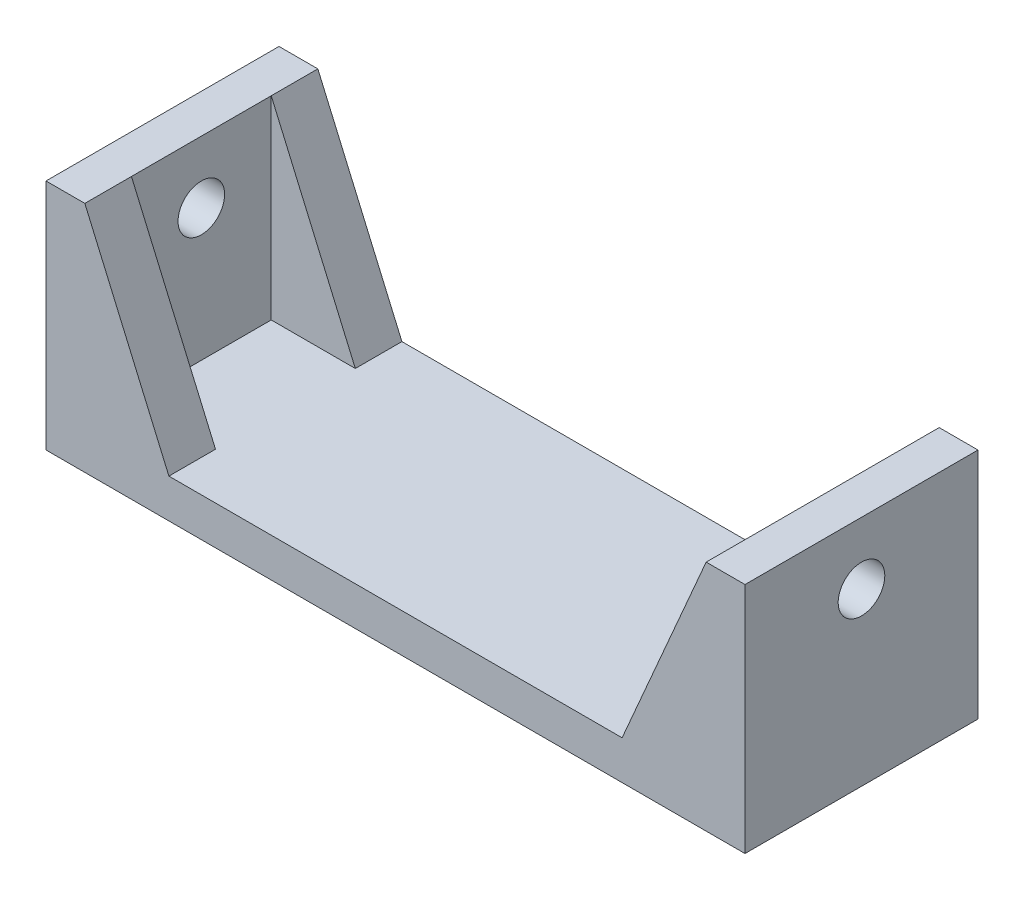
ISO-10303-21;
HEADER;
FILE_DESCRIPTION(('STEP AP214'),'2;1');
FILE_NAME('part.step','',(''),(''),'','','');
FILE_SCHEMA(('AUTOMOTIVE_DESIGN { 1 0 10303 214 1 1 1 1 }'));
ENDSEC;
DATA;
#1=APPLICATION_CONTEXT('core data for automotive mechanical design processes');
#2=APPLICATION_PROTOCOL_DEFINITION('international standard','automotive_design',2000,#1);
#3=PRODUCT_CONTEXT('',#1,'mechanical');
#4=PRODUCT('Part','Part','',(#3));
#5=PRODUCT_RELATED_PRODUCT_CATEGORY('part','',(#4));
#6=PRODUCT_DEFINITION_FORMATION('','',#4);
#7=PRODUCT_DEFINITION_CONTEXT('part definition',#1,'design');
#8=PRODUCT_DEFINITION('design','',#6,#7);
#9=PRODUCT_DEFINITION_SHAPE('','',#8);
#10=(LENGTH_UNIT() NAMED_UNIT(*) SI_UNIT(.MILLI.,.METRE.));
#11=(NAMED_UNIT(*) PLANE_ANGLE_UNIT() SI_UNIT($,.RADIAN.));
#12=(NAMED_UNIT(*) SI_UNIT($,.STERADIAN.) SOLID_ANGLE_UNIT());
#13=UNCERTAINTY_MEASURE_WITH_UNIT(LENGTH_MEASURE(1.E-05),#10,'distance_accuracy_value','');
#14=(GEOMETRIC_REPRESENTATION_CONTEXT(3) GLOBAL_UNCERTAINTY_ASSIGNED_CONTEXT((#13)) GLOBAL_UNIT_ASSIGNED_CONTEXT((#10,
#11,#12)) REPRESENTATION_CONTEXT('',''));
#15=CARTESIAN_POINT('',(0.,0.,0.));
#16=DIRECTION('',(0.,0.,1.));
#17=DIRECTION('',(1.,0.,0.));
#18=AXIS2_PLACEMENT_3D('',#15,#16,#17);
#19=CARTESIAN_POINT('',(5.,30.,0.));
#20=DIRECTION('',(1.,0.,0.));
#21=DIRECTION('',(0.,0.,-1.));
#22=AXIS2_PLACEMENT_3D('',#19,#20,#21);
#23=PLANE('',#22);
#24=CARTESIAN_POINT('',(5.,22.,-15.));
#25=DIRECTION('',(1.,0.,0.));
#26=DIRECTION('',(0.,0.,-1.));
#27=AXIS2_PLACEMENT_3D('',#24,#25,#26);
#28=CIRCLE('',#27,3.);
#29=CARTESIAN_POINT('',(5.,22.,-18.));
#30=VERTEX_POINT('',#29);
#31=EDGE_CURVE('E185',#30,#30,#28,.T.);
#32=ORIENTED_EDGE('',*,*,#31,.F.);
#33=EDGE_LOOP('',(#32));
#34=FACE_BOUND('',#33,.T.);
#35=DIRECTION('',(0.,0.,1.));
#36=VECTOR('',#35,1.);
#37=CARTESIAN_POINT('',(5.,5.,0.));
#38=LINE('',#37,#36);
#39=CARTESIAN_POINT('',(5.,5.,-24.));
#40=VERTEX_POINT('',#39);
#41=CARTESIAN_POINT('',(5.,5.,-6.));
#42=VERTEX_POINT('',#41);
#43=EDGE_CURVE('E191',#40,#42,#38,.T.);
#44=ORIENTED_EDGE('',*,*,#43,.F.);
#45=DIRECTION('',(0.,1.,0.));
#46=VECTOR('',#45,1.);
#47=CARTESIAN_POINT('',(5.,30.,-24.));
#48=LINE('',#47,#46);
#49=CARTESIAN_POINT('',(5.,30.,-24.));
#50=VERTEX_POINT('',#49);
#51=EDGE_CURVE('E47',#40,#50,#48,.T.);
#52=ORIENTED_EDGE('',*,*,#51,.T.);
#53=DIRECTION('',(0.,0.,1.));
#54=VECTOR('',#53,1.);
#55=CARTESIAN_POINT('',(5.,30.,0.));
#56=LINE('',#55,#54);
#57=CARTESIAN_POINT('',(5.,30.,-6.));
#58=VERTEX_POINT('',#57);
#59=EDGE_CURVE('E203',#50,#58,#56,.T.);
#60=ORIENTED_EDGE('',*,*,#59,.T.);
#61=DIRECTION('',(0.,-1.,0.));
#62=VECTOR('',#61,1.);
#63=CARTESIAN_POINT('',(5.,30.,-6.));
#64=LINE('',#63,#62);
#65=EDGE_CURVE('E173',#58,#42,#64,.T.);
#66=ORIENTED_EDGE('',*,*,#65,.T.);
#67=EDGE_LOOP('',(#44,#52,#60,#66));
#68=FACE_BOUND('',#67,.T.);
#69=ADVANCED_FACE('F32',(#34,#68),#23,.T.);
#70=CARTESIAN_POINT('',(85.,30.,0.));
#71=DIRECTION('',(-1.,0.,0.));
#72=DIRECTION('',(0.,0.,1.));
#73=AXIS2_PLACEMENT_3D('',#70,#71,#72);
#74=PLANE('',#73);
#75=CARTESIAN_POINT('',(85.,22.,-15.));
#76=DIRECTION('',(-1.,0.,0.));
#77=DIRECTION('',(0.,0.,1.));
#78=AXIS2_PLACEMENT_3D('',#75,#76,#77);
#79=CIRCLE('',#78,3.);
#80=CARTESIAN_POINT('',(85.,22.,-18.));
#81=VERTEX_POINT('',#80);
#82=EDGE_CURVE('E184',#81,#81,#79,.T.);
#83=ORIENTED_EDGE('',*,*,#82,.F.);
#84=EDGE_LOOP('',(#83));
#85=FACE_BOUND('',#84,.T.);
#86=DIRECTION('',(0.,0.,-1.));
#87=VECTOR('',#86,1.);
#88=CARTESIAN_POINT('',(85.,30.,0.));
#89=LINE('',#88,#87);
#90=CARTESIAN_POINT('',(85.,30.,-6.));
#91=VERTEX_POINT('',#90);
#92=CARTESIAN_POINT('',(85.,30.,-24.));
#93=VERTEX_POINT('',#92);
#94=EDGE_CURVE('E201',#91,#93,#89,.T.);
#95=ORIENTED_EDGE('',*,*,#94,.T.);
#96=DIRECTION('',(0.,-1.,0.));
#97=VECTOR('',#96,1.);
#98=CARTESIAN_POINT('',(85.,30.,-24.));
#99=LINE('',#98,#97);
#100=CARTESIAN_POINT('',(85.,5.,-24.));
#101=VERTEX_POINT('',#100);
#102=EDGE_CURVE('E153',#93,#101,#99,.T.);
#103=ORIENTED_EDGE('',*,*,#102,.T.);
#104=DIRECTION('',(0.,0.,-1.));
#105=VECTOR('',#104,1.);
#106=CARTESIAN_POINT('',(85.,5.,0.));
#107=LINE('',#106,#105);
#108=CARTESIAN_POINT('',(85.,5.,-6.));
#109=VERTEX_POINT('',#108);
#110=EDGE_CURVE('E194',#109,#101,#107,.T.);
#111=ORIENTED_EDGE('',*,*,#110,.F.);
#112=DIRECTION('',(0.,1.,0.));
#113=VECTOR('',#112,1.);
#114=CARTESIAN_POINT('',(85.,30.,-6.));
#115=LINE('',#114,#113);
#116=EDGE_CURVE('E165',#109,#91,#115,.T.);
#117=ORIENTED_EDGE('',*,*,#116,.T.);
#118=EDGE_LOOP('',(#95,#103,#111,#117));
#119=FACE_BOUND('',#118,.T.);
#120=ADVANCED_FACE('F264',(#85,#119),#74,.T.);
#121=CARTESIAN_POINT('',(0.,30.,0.));
#122=DIRECTION('',(0.,-1.,0.));
#123=DIRECTION('',(0.,0.,-1.));
#124=AXIS2_PLACEMENT_3D('',#121,#122,#123);
#125=PLANE('',#124);
#126=DIRECTION('',(0.,0.,1.));
#127=VECTOR('',#126,1.);
#128=CARTESIAN_POINT('',(0.,30.,0.));
#129=LINE('',#128,#127);
#130=CARTESIAN_POINT('',(0.,30.,-30.));
#131=VERTEX_POINT('',#130);
#132=CARTESIAN_POINT('',(0.,30.,0.));
#133=VERTEX_POINT('',#132);
#134=EDGE_CURVE('E205',#131,#133,#129,.T.);
#135=ORIENTED_EDGE('',*,*,#134,.T.);
#136=DIRECTION('',(1.,0.,0.));
#137=VECTOR('',#136,1.);
#138=CARTESIAN_POINT('',(0.,30.,0.));
#139=LINE('',#138,#137);
#140=CARTESIAN_POINT('',(5.,30.,0.));
#141=VERTEX_POINT('',#140);
#142=EDGE_CURVE('E209',#133,#141,#139,.T.);
#143=ORIENTED_EDGE('',*,*,#142,.T.);
#144=DIRECTION('',(0.,0.,-1.));
#145=VECTOR('',#144,1.);
#146=CARTESIAN_POINT('',(5.,30.,0.));
#147=LINE('',#146,#145);
#148=EDGE_CURVE('E178',#58,#141,#147,.F.);
#149=ORIENTED_EDGE('',*,*,#148,.F.);
#150=ORIENTED_EDGE('',*,*,#59,.F.);
#151=CARTESIAN_POINT('',(5.,30.,-30.));
#152=VERTEX_POINT('',#151);
#153=EDGE_CURVE('E143',#152,#50,#56,.T.);
#154=ORIENTED_EDGE('',*,*,#153,.F.);
#155=DIRECTION('',(-1.,0.,0.));
#156=VECTOR('',#155,1.);
#157=CARTESIAN_POINT('',(0.,30.,-30.));
#158=LINE('',#157,#156);
#159=EDGE_CURVE('E213',#152,#131,#158,.T.);
#160=ORIENTED_EDGE('',*,*,#159,.T.);
#161=EDGE_LOOP('',(#135,#143,#149,#150,#154,#160));
#162=FACE_BOUND('',#161,.T.);
#163=ADVANCED_FACE('F284',(#162),#125,.F.);
#164=DIRECTION('',(0.,0.,1.));
#165=VECTOR('',#164,1.);
#166=CARTESIAN_POINT('',(85.,30.,0.));
#167=LINE('',#166,#165);
#168=CARTESIAN_POINT('',(85.,30.,-30.));
#169=VERTEX_POINT('',#168);
#170=EDGE_CURVE('E158',#93,#169,#167,.F.);
#171=ORIENTED_EDGE('',*,*,#170,.F.);
#172=ORIENTED_EDGE('',*,*,#94,.F.);
#173=CARTESIAN_POINT('',(85.,30.,0.));
#174=VERTEX_POINT('',#173);
#175=EDGE_CURVE('E197',#174,#91,#89,.T.);
#176=ORIENTED_EDGE('',*,*,#175,.F.);
#177=CARTESIAN_POINT('',(90.,30.,0.));
#178=VERTEX_POINT('',#177);
#179=EDGE_CURVE('E207',#174,#178,#139,.T.);
#180=ORIENTED_EDGE('',*,*,#179,.T.);
#181=DIRECTION('',(0.,0.,-1.));
#182=VECTOR('',#181,1.);
#183=CARTESIAN_POINT('',(90.,30.,0.));
#184=LINE('',#183,#182);
#185=CARTESIAN_POINT('',(90.,30.,-30.));
#186=VERTEX_POINT('',#185);
#187=EDGE_CURVE('E211',#178,#186,#184,.T.);
#188=ORIENTED_EDGE('',*,*,#187,.T.);
#189=EDGE_CURVE('E214',#186,#169,#158,.T.);
#190=ORIENTED_EDGE('',*,*,#189,.T.);
#191=EDGE_LOOP('',(#171,#172,#176,#180,#188,#190));
#192=FACE_BOUND('',#191,.T.);
#193=ADVANCED_FACE('F261',(#192),#125,.F.);
#194=CARTESIAN_POINT('',(0.,30.,0.));
#195=DIRECTION('',(1.,0.,0.));
#196=DIRECTION('',(0.,0.,-1.));
#197=AXIS2_PLACEMENT_3D('',#194,#195,#196);
#198=PLANE('',#197);
#199=DIRECTION('',(0.,0.,1.));
#200=VECTOR('',#199,1.);
#201=CARTESIAN_POINT('',(0.,0.,0.));
#202=LINE('',#201,#200);
#203=CARTESIAN_POINT('',(0.,0.,-30.));
#204=VERTEX_POINT('',#203);
#205=CARTESIAN_POINT('',(0.,0.,0.));
#206=VERTEX_POINT('',#205);
#207=EDGE_CURVE('E200',#204,#206,#202,.T.);
#208=ORIENTED_EDGE('',*,*,#207,.T.);
#209=DIRECTION('',(0.,-1.,0.));
#210=VECTOR('',#209,1.);
#211=CARTESIAN_POINT('',(0.,30.,0.));
#212=LINE('',#211,#210);
#213=EDGE_CURVE('E231',#133,#206,#212,.T.);
#214=ORIENTED_EDGE('',*,*,#213,.F.);
#215=ORIENTED_EDGE('',*,*,#134,.F.);
#216=DIRECTION('',(0.,-1.,0.));
#217=VECTOR('',#216,1.);
#218=CARTESIAN_POINT('',(0.,30.,-30.));
#219=LINE('',#218,#217);
#220=EDGE_CURVE('E216',#131,#204,#219,.T.);
#221=ORIENTED_EDGE('',*,*,#220,.T.);
#222=EDGE_LOOP('',(#208,#214,#215,#221));
#223=FACE_BOUND('',#222,.T.);
#224=CARTESIAN_POINT('',(0.,22.,-15.));
#225=DIRECTION('',(1.,0.,0.));
#226=DIRECTION('',(0.,0.,-1.));
#227=AXIS2_PLACEMENT_3D('',#224,#225,#226);
#228=CIRCLE('',#227,3.);
#229=CARTESIAN_POINT('',(0.,22.,-18.));
#230=VERTEX_POINT('',#229);
#231=EDGE_CURVE('E181',#230,#230,#228,.T.);
#232=ORIENTED_EDGE('',*,*,#231,.T.);
#233=EDGE_LOOP('',(#232));
#234=FACE_BOUND('',#233,.T.);
#235=ADVANCED_FACE('F34',(#223,#234),#198,.F.);
#236=CARTESIAN_POINT('',(0.,30.,0.));
#237=DIRECTION('',(0.,0.,-1.));
#238=DIRECTION('',(-1.,0.,0.));
#239=AXIS2_PLACEMENT_3D('',#236,#237,#238);
#240=PLANE('',#239);
#241=ORIENTED_EDGE('',*,*,#179,.F.);
#242=DIRECTION('',(-0.397352390435187,-0.917666103664858,0.));
#243=VECTOR('',#242,1.);
#244=CARTESIAN_POINT('',(85.,30.,0.));
#245=LINE('',#244,#243);
#246=CARTESIAN_POINT('',(74.1749191550093,5.,0.));
#247=VERTEX_POINT('',#246);
#248=EDGE_CURVE('E162',#174,#247,#245,.T.);
#249=ORIENTED_EDGE('',*,*,#248,.T.);
#250=DIRECTION('',(1.,0.,0.));
#251=VECTOR('',#250,1.);
#252=CARTESIAN_POINT('',(0.,5.,0.));
#253=LINE('',#252,#251);
#254=CARTESIAN_POINT('',(15.8250808449907,5.,0.));
#255=VERTEX_POINT('',#254);
#256=EDGE_CURVE('E193',#255,#247,#253,.T.);
#257=ORIENTED_EDGE('',*,*,#256,.F.);
#258=DIRECTION('',(0.397352390435187,-0.917666103664858,0.));
#259=VECTOR('',#258,1.);
#260=CARTESIAN_POINT('',(5.,30.,0.));
#261=LINE('',#260,#259);
#262=EDGE_CURVE('E170',#141,#255,#261,.T.);
#263=ORIENTED_EDGE('',*,*,#262,.F.);
#264=ORIENTED_EDGE('',*,*,#142,.F.);
#265=ORIENTED_EDGE('',*,*,#213,.T.);
#266=DIRECTION('',(1.,0.,0.));
#267=VECTOR('',#266,1.);
#268=CARTESIAN_POINT('',(0.,0.,0.));
#269=LINE('',#268,#267);
#270=CARTESIAN_POINT('',(90.,0.,0.));
#271=VERTEX_POINT('',#270);
#272=EDGE_CURVE('E218',#206,#271,#269,.T.);
#273=ORIENTED_EDGE('',*,*,#272,.T.);
#274=DIRECTION('',(0.,-1.,0.));
#275=VECTOR('',#274,1.);
#276=CARTESIAN_POINT('',(90.,30.,0.));
#277=LINE('',#276,#275);
#278=EDGE_CURVE('E228',#178,#271,#277,.T.);
#279=ORIENTED_EDGE('',*,*,#278,.F.);
#280=EDGE_LOOP('',(#241,#249,#257,#263,#264,#265,#273,#279));
#281=FACE_BOUND('',#280,.T.);
#282=ADVANCED_FACE('F305',(#281),#240,.F.);
#283=CARTESIAN_POINT('',(90.,30.,0.));
#284=DIRECTION('',(-1.,0.,0.));
#285=DIRECTION('',(0.,0.,1.));
#286=AXIS2_PLACEMENT_3D('',#283,#284,#285);
#287=PLANE('',#286);
#288=DIRECTION('',(0.,-1.,0.));
#289=VECTOR('',#288,1.);
#290=CARTESIAN_POINT('',(90.,30.,-30.));
#291=LINE('',#290,#289);
#292=CARTESIAN_POINT('',(90.,0.,-30.));
#293=VERTEX_POINT('',#292);
#294=EDGE_CURVE('E225',#186,#293,#291,.T.);
#295=ORIENTED_EDGE('',*,*,#294,.F.);
#296=ORIENTED_EDGE('',*,*,#187,.F.);
#297=ORIENTED_EDGE('',*,*,#278,.T.);
#298=DIRECTION('',(0.,0.,-1.));
#299=VECTOR('',#298,1.);
#300=CARTESIAN_POINT('',(90.,0.,0.));
#301=LINE('',#300,#299);
#302=EDGE_CURVE('E220',#271,#293,#301,.T.);
#303=ORIENTED_EDGE('',*,*,#302,.T.);
#304=EDGE_LOOP('',(#295,#296,#297,#303));
#305=FACE_BOUND('',#304,.T.);
#306=CARTESIAN_POINT('',(90.,22.,-15.));
#307=DIRECTION('',(-1.,0.,0.));
#308=DIRECTION('',(0.,0.,1.));
#309=AXIS2_PLACEMENT_3D('',#306,#307,#308);
#310=CIRCLE('',#309,3.);
#311=CARTESIAN_POINT('',(90.,22.,-18.));
#312=VERTEX_POINT('',#311);
#313=EDGE_CURVE('E188',#312,#312,#310,.T.);
#314=ORIENTED_EDGE('',*,*,#313,.T.);
#315=EDGE_LOOP('',(#314));
#316=FACE_BOUND('',#315,.T.);
#317=ADVANCED_FACE('F303',(#305,#316),#287,.F.);
#318=CARTESIAN_POINT('',(0.,30.,-30.));
#319=DIRECTION('',(0.,0.,1.));
#320=DIRECTION('',(1.,0.,0.));
#321=AXIS2_PLACEMENT_3D('',#318,#319,#320);
#322=PLANE('',#321);
#323=ORIENTED_EDGE('',*,*,#159,.F.);
#324=DIRECTION('',(0.397352390435187,-0.917666103664858,0.));
#325=VECTOR('',#324,1.);
#326=CARTESIAN_POINT('',(5.,30.,-30.));
#327=LINE('',#326,#325);
#328=CARTESIAN_POINT('',(15.8250808449907,5.,-30.));
#329=VERTEX_POINT('',#328);
#330=EDGE_CURVE('E144',#152,#329,#327,.T.);
#331=ORIENTED_EDGE('',*,*,#330,.T.);
#332=DIRECTION('',(-1.,0.,0.));
#333=VECTOR('',#332,1.);
#334=CARTESIAN_POINT('',(0.,5.,-30.));
#335=LINE('',#334,#333);
#336=CARTESIAN_POINT('',(74.1749191550093,5.,-30.));
#337=VERTEX_POINT('',#336);
#338=EDGE_CURVE('E131',#337,#329,#335,.T.);
#339=ORIENTED_EDGE('',*,*,#338,.F.);
#340=DIRECTION('',(-0.397352390435187,-0.917666103664858,0.));
#341=VECTOR('',#340,1.);
#342=CARTESIAN_POINT('',(85.,30.,-30.));
#343=LINE('',#342,#341);
#344=EDGE_CURVE('E150',#169,#337,#343,.T.);
#345=ORIENTED_EDGE('',*,*,#344,.F.);
#346=ORIENTED_EDGE('',*,*,#189,.F.);
#347=ORIENTED_EDGE('',*,*,#294,.T.);
#348=DIRECTION('',(-1.,0.,0.));
#349=VECTOR('',#348,1.);
#350=CARTESIAN_POINT('',(0.,0.,-30.));
#351=LINE('',#350,#349);
#352=EDGE_CURVE('E208',#293,#204,#351,.T.);
#353=ORIENTED_EDGE('',*,*,#352,.T.);
#354=ORIENTED_EDGE('',*,*,#220,.F.);
#355=EDGE_LOOP('',(#323,#331,#339,#345,#346,#347,#353,#354));
#356=FACE_BOUND('',#355,.T.);
#357=ADVANCED_FACE('F255',(#356),#322,.F.);
#358=CARTESIAN_POINT('',(0.,0.,0.));
#359=DIRECTION('',(0.,-1.,0.));
#360=DIRECTION('',(0.,0.,-1.));
#361=AXIS2_PLACEMENT_3D('',#358,#359,#360);
#362=PLANE('',#361);
#363=ORIENTED_EDGE('',*,*,#207,.F.);
#364=ORIENTED_EDGE('',*,*,#352,.F.);
#365=ORIENTED_EDGE('',*,*,#302,.F.);
#366=ORIENTED_EDGE('',*,*,#272,.F.);
#367=EDGE_LOOP('',(#363,#364,#365,#366));
#368=FACE_BOUND('',#367,.T.);
#369=ADVANCED_FACE('F294',(#368),#362,.T.);
#370=CARTESIAN_POINT('',(0.,5.,0.));
#371=DIRECTION('',(0.,-1.,0.));
#372=DIRECTION('',(0.,0.,-1.));
#373=AXIS2_PLACEMENT_3D('',#370,#371,#372);
#374=PLANE('',#373);
#375=ORIENTED_EDGE('',*,*,#338,.T.);
#376=DIRECTION('',(0.,0.,1.));
#377=VECTOR('',#376,1.);
#378=CARTESIAN_POINT('',(15.8250808449907,5.,0.));
#379=LINE('',#378,#377);
#380=CARTESIAN_POINT('',(15.8250808449907,5.,-24.));
#381=VERTEX_POINT('',#380);
#382=EDGE_CURVE('E11',#329,#381,#379,.T.);
#383=ORIENTED_EDGE('',*,*,#382,.T.);
#384=DIRECTION('',(1.,0.,0.));
#385=VECTOR('',#384,1.);
#386=CARTESIAN_POINT('',(0.,5.,-24.));
#387=LINE('',#386,#385);
#388=EDGE_CURVE('E40',#40,#381,#387,.T.);
#389=ORIENTED_EDGE('',*,*,#388,.F.);
#390=ORIENTED_EDGE('',*,*,#43,.T.);
#391=DIRECTION('',(-1.,0.,0.));
#392=VECTOR('',#391,1.);
#393=CARTESIAN_POINT('',(0.,5.,-6.));
#394=LINE('',#393,#392);
#395=CARTESIAN_POINT('',(15.8250808449907,5.,-6.));
#396=VERTEX_POINT('',#395);
#397=EDGE_CURVE('E234',#396,#42,#394,.T.);
#398=ORIENTED_EDGE('',*,*,#397,.F.);
#399=DIRECTION('',(0.,0.,-1.));
#400=VECTOR('',#399,1.);
#401=CARTESIAN_POINT('',(15.8250808449907,5.,0.));
#402=LINE('',#401,#400);
#403=EDGE_CURVE('E239',#396,#255,#402,.F.);
#404=ORIENTED_EDGE('',*,*,#403,.T.);
#405=ORIENTED_EDGE('',*,*,#256,.T.);
#406=DIRECTION('',(0.,0.,-1.));
#407=VECTOR('',#406,1.);
#408=CARTESIAN_POINT('',(74.1749191550093,5.,0.));
#409=LINE('',#408,#407);
#410=CARTESIAN_POINT('',(74.1749191550093,5.,-6.));
#411=VERTEX_POINT('',#410);
#412=EDGE_CURVE('E244',#247,#411,#409,.T.);
#413=ORIENTED_EDGE('',*,*,#412,.T.);
#414=DIRECTION('',(-1.,0.,0.));
#415=VECTOR('',#414,1.);
#416=CARTESIAN_POINT('',(0.,5.,-6.));
#417=LINE('',#416,#415);
#418=EDGE_CURVE('E241',#109,#411,#417,.T.);
#419=ORIENTED_EDGE('',*,*,#418,.F.);
#420=ORIENTED_EDGE('',*,*,#110,.T.);
#421=DIRECTION('',(1.,0.,0.));
#422=VECTOR('',#421,1.);
#423=CARTESIAN_POINT('',(0.,5.,-24.));
#424=LINE('',#423,#422);
#425=CARTESIAN_POINT('',(74.1749191550093,5.,-24.));
#426=VERTEX_POINT('',#425);
#427=EDGE_CURVE('E246',#426,#101,#424,.T.);
#428=ORIENTED_EDGE('',*,*,#427,.F.);
#429=DIRECTION('',(0.,0.,1.));
#430=VECTOR('',#429,1.);
#431=CARTESIAN_POINT('',(74.1749191550093,5.,0.));
#432=LINE('',#431,#430);
#433=EDGE_CURVE('E140',#426,#337,#432,.F.);
#434=ORIENTED_EDGE('',*,*,#433,.T.);
#435=EDGE_LOOP('',(#375,#383,#389,#390,#398,#404,#405,#413,#419,#420,#428,#434));
#436=FACE_BOUND('',#435,.T.);
#437=ADVANCED_FACE('F129',(#436),#374,.F.);
#438=CARTESIAN_POINT('',(0.,22.,-15.));
#439=DIRECTION('',(1.,0.,0.));
#440=DIRECTION('',(0.,0.,-1.));
#441=AXIS2_PLACEMENT_3D('',#438,#439,#440);
#442=CYLINDRICAL_SURFACE('',#441,3.);
#443=CARTESIAN_POINT('',(85.,22.,-18.));
#444=CARTESIAN_POINT('',(85.0520833333333,22.,-18.));
#445=CARTESIAN_POINT('',(85.1041666666667,22.,-18.));
#446=CARTESIAN_POINT('',(85.2083333333333,22.,-18.));
#447=CARTESIAN_POINT('',(85.2604166666667,22.,-18.));
#448=CARTESIAN_POINT('',(85.3645833333333,22.,-18.));
#449=CARTESIAN_POINT('',(85.4166666666667,22.,-18.));
#450=CARTESIAN_POINT('',(85.5208333333333,22.,-18.));
#451=CARTESIAN_POINT('',(85.5729166666667,22.,-18.));
#452=CARTESIAN_POINT('',(85.6770833333333,22.,-18.));
#453=CARTESIAN_POINT('',(85.7291666666667,22.,-18.));
#454=CARTESIAN_POINT('',(85.8333333333333,22.,-18.));
#455=CARTESIAN_POINT('',(85.8854166666667,22.,-18.));
#456=CARTESIAN_POINT('',(85.9895833333333,22.,-18.));
#457=CARTESIAN_POINT('',(86.0416666666667,22.,-18.));
#458=CARTESIAN_POINT('',(86.1458333333333,22.,-18.));
#459=CARTESIAN_POINT('',(86.1979166666667,22.,-18.));
#460=CARTESIAN_POINT('',(86.3020833333333,22.,-18.));
#461=CARTESIAN_POINT('',(86.3541666666667,22.,-18.));
#462=CARTESIAN_POINT('',(86.4583333333333,22.,-18.));
#463=CARTESIAN_POINT('',(86.5104166666667,22.,-18.));
#464=CARTESIAN_POINT('',(86.6145833333333,22.,-18.));
#465=CARTESIAN_POINT('',(86.6666666666667,22.,-18.));
#466=CARTESIAN_POINT('',(86.7708333333333,22.,-18.));
#467=CARTESIAN_POINT('',(86.8229166666667,22.,-18.));
#468=CARTESIAN_POINT('',(86.9270833333333,22.,-18.));
#469=CARTESIAN_POINT('',(86.9791666666667,22.,-18.));
#470=CARTESIAN_POINT('',(87.0833333333333,22.,-18.));
#471=CARTESIAN_POINT('',(87.1354166666667,22.,-18.));
#472=CARTESIAN_POINT('',(87.2395833333333,22.,-18.));
#473=CARTESIAN_POINT('',(87.2916666666667,22.,-18.));
#474=CARTESIAN_POINT('',(87.3958333333333,22.,-18.));
#475=CARTESIAN_POINT('',(87.4479166666667,22.,-18.));
#476=CARTESIAN_POINT('',(87.5520833333333,22.,-18.));
#477=CARTESIAN_POINT('',(87.6041666666667,22.,-18.));
#478=CARTESIAN_POINT('',(87.7083333333333,22.,-18.));
#479=CARTESIAN_POINT('',(87.7604166666667,22.,-18.));
#480=CARTESIAN_POINT('',(87.8645833333333,22.,-18.));
#481=CARTESIAN_POINT('',(87.9166666666667,22.,-18.));
#482=CARTESIAN_POINT('',(88.0208333333333,22.,-18.));
#483=CARTESIAN_POINT('',(88.0729166666667,22.,-18.));
#484=CARTESIAN_POINT('',(88.1770833333333,22.,-18.));
#485=CARTESIAN_POINT('',(88.2291666666667,22.,-18.));
#486=CARTESIAN_POINT('',(88.3333333333333,22.,-18.));
#487=CARTESIAN_POINT('',(88.3854166666667,22.,-18.));
#488=CARTESIAN_POINT('',(88.4895833333333,22.,-18.));
#489=CARTESIAN_POINT('',(88.5416666666667,22.,-18.));
#490=CARTESIAN_POINT('',(88.6458333333333,22.,-18.));
#491=CARTESIAN_POINT('',(88.6979166666667,22.,-18.));
#492=CARTESIAN_POINT('',(88.8020833333333,22.,-18.));
#493=CARTESIAN_POINT('',(88.8541666666667,22.,-18.));
#494=CARTESIAN_POINT('',(88.9583333333333,22.,-18.));
#495=CARTESIAN_POINT('',(89.0104166666667,22.,-18.));
#496=CARTESIAN_POINT('',(89.1145833333333,22.,-18.));
#497=CARTESIAN_POINT('',(89.1666666666667,22.,-18.));
#498=CARTESIAN_POINT('',(89.2708333333333,22.,-18.));
#499=CARTESIAN_POINT('',(89.3229166666667,22.,-18.));
#500=CARTESIAN_POINT('',(89.4270833333333,22.,-18.));
#501=CARTESIAN_POINT('',(89.4791666666667,22.,-18.));
#502=CARTESIAN_POINT('',(89.5833333333333,22.,-18.));
#503=CARTESIAN_POINT('',(89.6354166666667,22.,-18.));
#504=CARTESIAN_POINT('',(89.7395833333333,22.,-18.));
#505=CARTESIAN_POINT('',(89.7916666666667,22.,-18.));
#506=CARTESIAN_POINT('',(89.8958333333333,22.,-18.));
#507=CARTESIAN_POINT('',(89.9479166666667,22.,-18.));
#508=CARTESIAN_POINT('',(90.,22.,-18.));
#509=B_SPLINE_CURVE_WITH_KNOTS('',3,(#443,#444,#445,#446,#447,#448,#449,#450,#451,#452,#453,
#454,#455,#456,#457,#458,#459,#460,#461,#462,#463,#464,#465,#466,#467,#468,#469,#470,#471,#472,
#473,#474,#475,#476,#477,#478,#479,#480,#481,#482,#483,#484,#485,#486,#487,#488,#489,#490,#491,
#492,#493,#494,#495,#496,#497,#498,#499,#500,#501,#502,#503,#504,#505,#506,#507,#508),
.UNSPECIFIED.,.F.,.F.,(4,2,2,2,2,2,2,2,2,2,2,2,2,2,2,2,2,2,2,2,2,2,2,2,2,2,2,2,2,2,2,2,4),(0.,
0.156249999999997,0.312499999999993,0.468750000000004,0.625000000000001,0.781249999999997,
0.937500000000008,1.09375,1.25,1.40625,1.56249999999999,1.71875,1.875,2.03125,2.18750000000001,
2.34375000000001,2.5,2.65625,2.8125,2.96875000000001,3.125,3.28125,3.43750000000001,
3.59375000000001,3.75,3.90625,4.0625,4.21875000000001,4.375,4.53125,4.68750000000001,
4.84375000000001,5.),.UNSPECIFIED.);
#510=EDGE_CURVE('BSEAM289',#81,#312,#509,.T.);
#511=ORIENTED_EDGE('',*,*,#82,.T.);
#512=ORIENTED_EDGE('',*,*,#313,.F.);
#513=ORIENTED_EDGE('',*,*,#510,.T.);
#514=ORIENTED_EDGE('',*,*,#510,.F.);
#515=EDGE_LOOP('',(#511,#513,#512,#514));
#516=FACE_BOUND('',#515,.T.);
#517=ADVANCED_FACE('F289',(#516),#442,.F.);
#518=CARTESIAN_POINT('',(5.,22.,-18.));
#519=CARTESIAN_POINT('',(4.94791666666667,22.,-18.));
#520=CARTESIAN_POINT('',(4.89583333333333,22.,-18.));
#521=CARTESIAN_POINT('',(4.79166666666667,22.,-18.));
#522=CARTESIAN_POINT('',(4.73958333333333,22.,-18.));
#523=CARTESIAN_POINT('',(4.63541666666667,22.,-18.));
#524=CARTESIAN_POINT('',(4.58333333333333,22.,-18.));
#525=CARTESIAN_POINT('',(4.47916666666667,22.,-18.));
#526=CARTESIAN_POINT('',(4.42708333333333,22.,-18.));
#527=CARTESIAN_POINT('',(4.32291666666667,22.,-18.));
#528=CARTESIAN_POINT('',(4.27083333333333,22.,-18.));
#529=CARTESIAN_POINT('',(4.16666666666667,22.,-18.));
#530=CARTESIAN_POINT('',(4.11458333333333,22.,-18.));
#531=CARTESIAN_POINT('',(4.01041666666667,22.,-18.));
#532=CARTESIAN_POINT('',(3.95833333333333,22.,-18.));
#533=CARTESIAN_POINT('',(3.85416666666667,22.,-18.));
#534=CARTESIAN_POINT('',(3.80208333333333,22.,-18.));
#535=CARTESIAN_POINT('',(3.69791666666667,22.,-18.));
#536=CARTESIAN_POINT('',(3.64583333333333,22.,-18.));
#537=CARTESIAN_POINT('',(3.54166666666667,22.,-18.));
#538=CARTESIAN_POINT('',(3.48958333333333,22.,-18.));
#539=CARTESIAN_POINT('',(3.38541666666667,22.,-18.));
#540=CARTESIAN_POINT('',(3.33333333333333,22.,-18.));
#541=CARTESIAN_POINT('',(3.22916666666667,22.,-18.));
#542=CARTESIAN_POINT('',(3.17708333333333,22.,-18.));
#543=CARTESIAN_POINT('',(3.07291666666667,22.,-18.));
#544=CARTESIAN_POINT('',(3.02083333333333,22.,-18.));
#545=CARTESIAN_POINT('',(2.91666666666667,22.,-18.));
#546=CARTESIAN_POINT('',(2.86458333333333,22.,-18.));
#547=CARTESIAN_POINT('',(2.76041666666667,22.,-18.));
#548=CARTESIAN_POINT('',(2.70833333333333,22.,-18.));
#549=CARTESIAN_POINT('',(2.60416666666667,22.,-18.));
#550=CARTESIAN_POINT('',(2.55208333333333,22.,-18.));
#551=CARTESIAN_POINT('',(2.44791666666667,22.,-18.));
#552=CARTESIAN_POINT('',(2.39583333333333,22.,-18.));
#553=CARTESIAN_POINT('',(2.29166666666667,22.,-18.));
#554=CARTESIAN_POINT('',(2.23958333333333,22.,-18.));
#555=CARTESIAN_POINT('',(2.13541666666667,22.,-18.));
#556=CARTESIAN_POINT('',(2.08333333333333,22.,-18.));
#557=CARTESIAN_POINT('',(1.97916666666667,22.,-18.));
#558=CARTESIAN_POINT('',(1.92708333333333,22.,-18.));
#559=CARTESIAN_POINT('',(1.82291666666667,22.,-18.));
#560=CARTESIAN_POINT('',(1.77083333333333,22.,-18.));
#561=CARTESIAN_POINT('',(1.66666666666667,22.,-18.));
#562=CARTESIAN_POINT('',(1.61458333333333,22.,-18.));
#563=CARTESIAN_POINT('',(1.51041666666667,22.,-18.));
#564=CARTESIAN_POINT('',(1.45833333333333,22.,-18.));
#565=CARTESIAN_POINT('',(1.35416666666667,22.,-18.));
#566=CARTESIAN_POINT('',(1.30208333333333,22.,-18.));
#567=CARTESIAN_POINT('',(1.19791666666667,22.,-18.));
#568=CARTESIAN_POINT('',(1.14583333333333,22.,-18.));
#569=CARTESIAN_POINT('',(1.04166666666667,22.,-18.));
#570=CARTESIAN_POINT('',(0.989583333333333,22.,-18.));
#571=CARTESIAN_POINT('',(0.885416666666667,22.,-18.));
#572=CARTESIAN_POINT('',(0.833333333333333,22.,-18.));
#573=CARTESIAN_POINT('',(0.729166666666667,22.,-18.));
#574=CARTESIAN_POINT('',(0.677083333333334,22.,-18.));
#575=CARTESIAN_POINT('',(0.572916666666667,22.,-18.));
#576=CARTESIAN_POINT('',(0.520833333333334,22.,-18.));
#577=CARTESIAN_POINT('',(0.416666666666667,22.,-18.));
#578=CARTESIAN_POINT('',(0.364583333333334,22.,-18.));
#579=CARTESIAN_POINT('',(0.260416666666667,22.,-18.));
#580=CARTESIAN_POINT('',(0.208333333333333,22.,-18.));
#581=CARTESIAN_POINT('',(0.104166666666667,22.,-18.));
#582=CARTESIAN_POINT('',(0.0520833333333334,22.,-18.));
#583=CARTESIAN_POINT('',(0.,22.,-18.));
#584=B_SPLINE_CURVE_WITH_KNOTS('',3,(#518,#519,#520,#521,#522,#523,#524,#525,#526,#527,#528,
#529,#530,#531,#532,#533,#534,#535,#536,#537,#538,#539,#540,#541,#542,#543,#544,#545,#546,#547,
#548,#549,#550,#551,#552,#553,#554,#555,#556,#557,#558,#559,#560,#561,#562,#563,#564,#565,#566,
#567,#568,#569,#570,#571,#572,#573,#574,#575,#576,#577,#578,#579,#580,#581,#582,#583),
.UNSPECIFIED.,.F.,.F.,(4,2,2,2,2,2,2,2,2,2,2,2,2,2,2,2,2,2,2,2,2,2,2,2,2,2,2,2,2,2,2,2,4),(0.,
0.15625,0.3125,0.46875,0.625000000000001,0.78125,0.9375,1.09375,1.25,1.40625,1.5625,1.71875,
1.875,2.03125,2.1875,2.34375,2.5,2.65625,2.8125,2.96875,3.125,3.28125,3.4375,3.59375,3.75,
3.90625,4.0625,4.21875,4.375,4.53125,4.6875,4.84375,5.),.UNSPECIFIED.);
#585=EDGE_CURVE('BSEAM335',#30,#230,#584,.T.);
#586=ORIENTED_EDGE('',*,*,#31,.T.);
#587=ORIENTED_EDGE('',*,*,#231,.F.);
#588=ORIENTED_EDGE('',*,*,#585,.T.);
#589=ORIENTED_EDGE('',*,*,#585,.F.);
#590=EDGE_LOOP('',(#586,#588,#587,#589));
#591=FACE_BOUND('',#590,.T.);
#592=ADVANCED_FACE('F335',(#591),#442,.F.);
#593=CARTESIAN_POINT('',(5.,30.,0.));
#594=DIRECTION('',(-0.917666103664858,-0.397352390435188,0.));
#595=DIRECTION('',(0.397352390435187,-0.917666103664858,0.));
#596=AXIS2_PLACEMENT_3D('',#593,#594,#595);
#597=PLANE('',#596);
#598=DIRECTION('',(0.397352390435187,-0.917666103664858,0.));
#599=VECTOR('',#598,1.);
#600=CARTESIAN_POINT('',(5.,30.,-6.));
#601=LINE('',#600,#599);
#602=EDGE_CURVE('E169',#58,#396,#601,.T.);
#603=ORIENTED_EDGE('',*,*,#602,.F.);
#604=ORIENTED_EDGE('',*,*,#148,.T.);
#605=ORIENTED_EDGE('',*,*,#262,.T.);
#606=ORIENTED_EDGE('',*,*,#403,.F.);
#607=EDGE_LOOP('',(#603,#604,#605,#606));
#608=FACE_BOUND('',#607,.T.);
#609=ADVANCED_FACE('F332',(#608),#597,.F.);
#610=CARTESIAN_POINT('',(45.,15.,-6.));
#611=DIRECTION('',(0.,0.,1.));
#612=DIRECTION('',(1.,0.,0.));
#613=AXIS2_PLACEMENT_3D('',#610,#611,#612);
#614=PLANE('',#613);
#615=ORIENTED_EDGE('',*,*,#65,.F.);
#616=ORIENTED_EDGE('',*,*,#602,.T.);
#617=ORIENTED_EDGE('',*,*,#397,.T.);
#618=EDGE_LOOP('',(#615,#616,#617));
#619=FACE_BOUND('',#618,.T.);
#620=ADVANCED_FACE('F328',(#619),#614,.F.);
#621=CARTESIAN_POINT('',(85.,30.,0.));
#622=DIRECTION('',(-0.917666103664858,0.397352390435188,0.));
#623=DIRECTION('',(-0.397352390435187,-0.917666103664858,0.));
#624=AXIS2_PLACEMENT_3D('',#621,#622,#623);
#625=PLANE('',#624);
#626=ORIENTED_EDGE('',*,*,#248,.F.);
#627=ORIENTED_EDGE('',*,*,#175,.T.);
#628=DIRECTION('',(-0.397352390435187,-0.917666103664858,0.));
#629=VECTOR('',#628,1.);
#630=CARTESIAN_POINT('',(85.,30.,-6.));
#631=LINE('',#630,#629);
#632=EDGE_CURVE('E161',#91,#411,#631,.T.);
#633=ORIENTED_EDGE('',*,*,#632,.T.);
#634=ORIENTED_EDGE('',*,*,#412,.F.);
#635=EDGE_LOOP('',(#626,#627,#633,#634));
#636=FACE_BOUND('',#635,.T.);
#637=ADVANCED_FACE('F320',(#636),#625,.T.);
#638=CARTESIAN_POINT('',(45.,15.,-6.));
#639=DIRECTION('',(0.,0.,1.));
#640=DIRECTION('',(1.,0.,0.));
#641=AXIS2_PLACEMENT_3D('',#638,#639,#640);
#642=PLANE('',#641);
#643=ORIENTED_EDGE('',*,*,#116,.F.);
#644=ORIENTED_EDGE('',*,*,#418,.T.);
#645=ORIENTED_EDGE('',*,*,#632,.F.);
#646=EDGE_LOOP('',(#643,#644,#645));
#647=FACE_BOUND('',#646,.T.);
#648=ADVANCED_FACE('F276',(#647),#642,.F.);
#649=CARTESIAN_POINT('',(85.,30.,-30.));
#650=DIRECTION('',(0.917666103664858,-0.397352390435188,0.));
#651=DIRECTION('',(-0.397352390435187,-0.917666103664858,0.));
#652=AXIS2_PLACEMENT_3D('',#649,#650,#651);
#653=PLANE('',#652);
#654=DIRECTION('',(-0.397352390435187,-0.917666103664858,0.));
#655=VECTOR('',#654,1.);
#656=CARTESIAN_POINT('',(85.,30.,-24.));
#657=LINE('',#656,#655);
#658=EDGE_CURVE('E149',#93,#426,#657,.T.);
#659=ORIENTED_EDGE('',*,*,#658,.F.);
#660=ORIENTED_EDGE('',*,*,#170,.T.);
#661=ORIENTED_EDGE('',*,*,#344,.T.);
#662=ORIENTED_EDGE('',*,*,#433,.F.);
#663=EDGE_LOOP('',(#659,#660,#661,#662));
#664=FACE_BOUND('',#663,.T.);
#665=ADVANCED_FACE('F257',(#664),#653,.F.);
#666=CARTESIAN_POINT('',(45.,15.,-24.));
#667=DIRECTION('',(0.,0.,-1.));
#668=DIRECTION('',(-1.,0.,0.));
#669=AXIS2_PLACEMENT_3D('',#666,#667,#668);
#670=PLANE('',#669);
#671=ORIENTED_EDGE('',*,*,#102,.F.);
#672=ORIENTED_EDGE('',*,*,#658,.T.);
#673=ORIENTED_EDGE('',*,*,#427,.T.);
#674=EDGE_LOOP('',(#671,#672,#673));
#675=FACE_BOUND('',#674,.T.);
#676=ADVANCED_FACE('F268',(#675),#670,.F.);
#677=CARTESIAN_POINT('',(5.,30.,-30.));
#678=DIRECTION('',(0.917666103664858,0.397352390435188,0.));
#679=DIRECTION('',(0.397352390435187,-0.917666103664858,0.));
#680=AXIS2_PLACEMENT_3D('',#677,#678,#679);
#681=PLANE('',#680);
#682=ORIENTED_EDGE('',*,*,#330,.F.);
#683=ORIENTED_EDGE('',*,*,#153,.T.);
#684=DIRECTION('',(0.397352390435187,-0.917666103664858,0.));
#685=VECTOR('',#684,1.);
#686=CARTESIAN_POINT('',(5.,30.,-24.));
#687=LINE('',#686,#685);
#688=EDGE_CURVE('E139',#50,#381,#687,.T.);
#689=ORIENTED_EDGE('',*,*,#688,.T.);
#690=ORIENTED_EDGE('',*,*,#382,.F.);
#691=EDGE_LOOP('',(#682,#683,#689,#690));
#692=FACE_BOUND('',#691,.T.);
#693=ADVANCED_FACE('F142',(#692),#681,.T.);
#694=CARTESIAN_POINT('',(45.,15.,-24.));
#695=DIRECTION('',(0.,0.,-1.));
#696=DIRECTION('',(-1.,0.,0.));
#697=AXIS2_PLACEMENT_3D('',#694,#695,#696);
#698=PLANE('',#697);
#699=ORIENTED_EDGE('',*,*,#51,.F.);
#700=ORIENTED_EDGE('',*,*,#388,.T.);
#701=ORIENTED_EDGE('',*,*,#688,.F.);
#702=EDGE_LOOP('',(#699,#700,#701));
#703=FACE_BOUND('',#702,.T.);
#704=ADVANCED_FACE('F138',(#703),#698,.F.);
#705=CLOSED_SHELL('',(#69,#120,#163,#193,#235,#282,#317,#357,#369,#437,#517,#592,#609,#620,#637,
#648,#665,#676,#693,#704));
#706=MANIFOLD_SOLID_BREP('B2',#705);
#707=ADVANCED_BREP_SHAPE_REPRESENTATION('',(#18,#706),#14);
#708=SHAPE_DEFINITION_REPRESENTATION(#9,#707);
ENDSEC;
END-ISO-10303-21;
